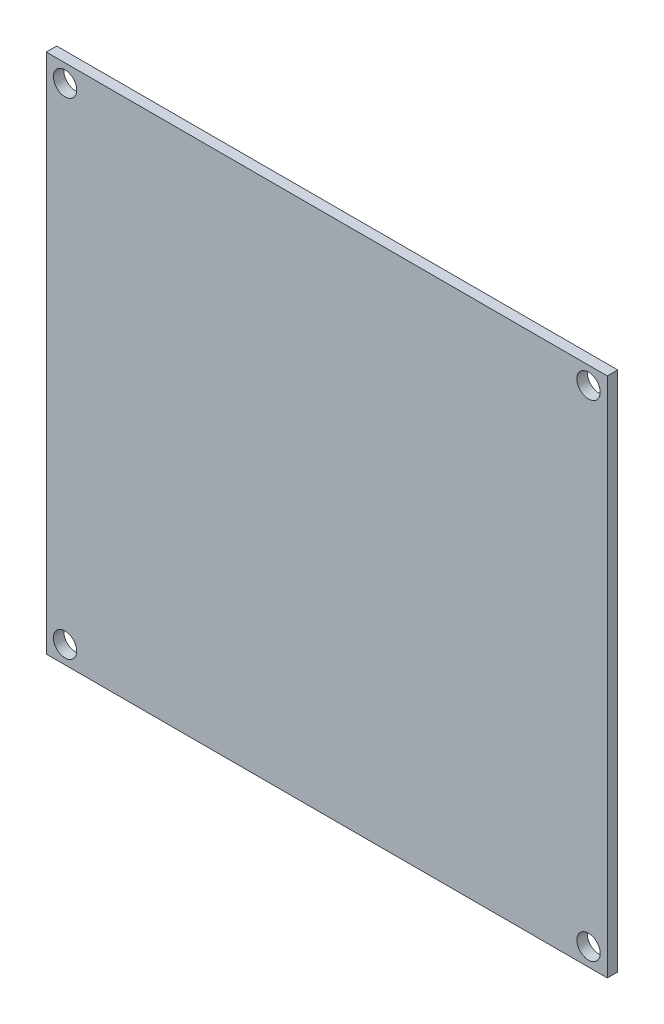
ISO-10303-21;
HEADER;
FILE_DESCRIPTION(('STEP AP214'),'2;1');
FILE_NAME('part.step','',(''),(''),'','','');
FILE_SCHEMA(('AUTOMOTIVE_DESIGN { 1 0 10303 214 1 1 1 1 }'));
ENDSEC;
DATA;
#1=APPLICATION_CONTEXT('core data for automotive mechanical design processes');
#2=APPLICATION_PROTOCOL_DEFINITION('international standard','automotive_design',2000,#1);
#3=PRODUCT_CONTEXT('',#1,'mechanical');
#4=PRODUCT('Part','Part','',(#3));
#5=PRODUCT_RELATED_PRODUCT_CATEGORY('part','',(#4));
#6=PRODUCT_DEFINITION_FORMATION('','',#4);
#7=PRODUCT_DEFINITION_CONTEXT('part definition',#1,'design');
#8=PRODUCT_DEFINITION('design','',#6,#7);
#9=PRODUCT_DEFINITION_SHAPE('','',#8);
#10=(LENGTH_UNIT() NAMED_UNIT(*) SI_UNIT(.MILLI.,.METRE.));
#11=(NAMED_UNIT(*) PLANE_ANGLE_UNIT() SI_UNIT($,.RADIAN.));
#12=(NAMED_UNIT(*) SI_UNIT($,.STERADIAN.) SOLID_ANGLE_UNIT());
#13=UNCERTAINTY_MEASURE_WITH_UNIT(LENGTH_MEASURE(1.E-05),#10,'distance_accuracy_value','');
#14=(GEOMETRIC_REPRESENTATION_CONTEXT(3) GLOBAL_UNCERTAINTY_ASSIGNED_CONTEXT((#13)) GLOBAL_UNIT_ASSIGNED_CONTEXT((#10,
#11,#12)) REPRESENTATION_CONTEXT('',''));
#15=CARTESIAN_POINT('',(0.,0.,0.));
#16=DIRECTION('',(0.,0.,1.));
#17=DIRECTION('',(1.,0.,0.));
#18=AXIS2_PLACEMENT_3D('',#15,#16,#17);
#19=CARTESIAN_POINT('',(68.326,-63.5,2.54));
#20=DIRECTION('',(-1.,0.,0.));
#21=DIRECTION('',(0.,0.,1.));
#22=AXIS2_PLACEMENT_3D('',#19,#20,#21);
#23=PLANE('',#22);
#24=DIRECTION('',(0.,1.,0.));
#25=VECTOR('',#24,1.);
#26=CARTESIAN_POINT('',(68.326,-63.5,0.));
#27=LINE('',#26,#25);
#28=CARTESIAN_POINT('',(68.326,-63.5,0.));
#29=VERTEX_POINT('',#28);
#30=CARTESIAN_POINT('',(68.326,63.5,0.));
#31=VERTEX_POINT('',#30);
#32=EDGE_CURVE('E110',#29,#31,#27,.T.);
#33=ORIENTED_EDGE('',*,*,#32,.T.);
#34=DIRECTION('',(0.,0.,-1.));
#35=VECTOR('',#34,1.);
#36=CARTESIAN_POINT('',(68.326,63.5,2.54));
#37=LINE('',#36,#35);
#38=CARTESIAN_POINT('',(68.326,63.5,2.54));
#39=VERTEX_POINT('',#38);
#40=EDGE_CURVE('E12',#39,#31,#37,.T.);
#41=ORIENTED_EDGE('',*,*,#40,.F.);
#42=DIRECTION('',(0.,1.,0.));
#43=VECTOR('',#42,1.);
#44=CARTESIAN_POINT('',(68.326,-63.5,2.54));
#45=LINE('',#44,#43);
#46=CARTESIAN_POINT('',(68.326,-63.5,2.54));
#47=VERTEX_POINT('',#46);
#48=EDGE_CURVE('E92',#47,#39,#45,.T.);
#49=ORIENTED_EDGE('',*,*,#48,.F.);
#50=DIRECTION('',(0.,0.,-1.));
#51=VECTOR('',#50,1.);
#52=CARTESIAN_POINT('',(68.326,-63.5,2.54));
#53=LINE('',#52,#51);
#54=EDGE_CURVE('E59',#47,#29,#53,.T.);
#55=ORIENTED_EDGE('',*,*,#54,.T.);
#56=EDGE_LOOP('',(#33,#41,#49,#55));
#57=FACE_BOUND('',#56,.T.);
#58=ADVANCED_FACE('F42',(#57),#23,.F.);
#59=CARTESIAN_POINT('',(68.326,63.5,2.54));
#60=DIRECTION('',(0.,-1.,0.));
#61=DIRECTION('',(1.,0.,0.));
#62=AXIS2_PLACEMENT_3D('',#59,#60,#61);
#63=PLANE('',#62);
#64=DIRECTION('',(-1.,0.,0.));
#65=VECTOR('',#64,1.);
#66=CARTESIAN_POINT('',(68.326,63.5,0.));
#67=LINE('',#66,#65);
#68=CARTESIAN_POINT('',(-68.326,63.5,0.));
#69=VERTEX_POINT('',#68);
#70=EDGE_CURVE('E98',#31,#69,#67,.T.);
#71=ORIENTED_EDGE('',*,*,#70,.T.);
#72=DIRECTION('',(0.,0.,-1.));
#73=VECTOR('',#72,1.);
#74=CARTESIAN_POINT('',(-68.326,63.5,2.54));
#75=LINE('',#74,#73);
#76=CARTESIAN_POINT('',(-68.326,63.5,2.54));
#77=VERTEX_POINT('',#76);
#78=EDGE_CURVE('E51',#77,#69,#75,.T.);
#79=ORIENTED_EDGE('',*,*,#78,.F.);
#80=DIRECTION('',(-1.,0.,0.));
#81=VECTOR('',#80,1.);
#82=CARTESIAN_POINT('',(68.326,63.5,2.54));
#83=LINE('',#82,#81);
#84=EDGE_CURVE('E84',#39,#77,#83,.T.);
#85=ORIENTED_EDGE('',*,*,#84,.F.);
#86=ORIENTED_EDGE('',*,*,#40,.T.);
#87=EDGE_LOOP('',(#71,#79,#85,#86));
#88=FACE_BOUND('',#87,.T.);
#89=ADVANCED_FACE('F97',(#88),#63,.F.);
#90=CARTESIAN_POINT('',(-68.326,-63.5,2.54));
#91=DIRECTION('',(-1.,0.,0.));
#92=DIRECTION('',(0.,0.,1.));
#93=AXIS2_PLACEMENT_3D('',#90,#91,#92);
#94=PLANE('',#93);
#95=DIRECTION('',(0.,1.,0.));
#96=VECTOR('',#95,1.);
#97=CARTESIAN_POINT('',(-68.326,-63.5,0.));
#98=LINE('',#97,#96);
#99=CARTESIAN_POINT('',(-68.326,-63.5,0.));
#100=VERTEX_POINT('',#99);
#101=EDGE_CURVE('E116',#100,#69,#98,.T.);
#102=ORIENTED_EDGE('',*,*,#101,.F.);
#103=DIRECTION('',(0.,0.,-1.));
#104=VECTOR('',#103,1.);
#105=CARTESIAN_POINT('',(-68.326,-63.5,2.54));
#106=LINE('',#105,#104);
#107=CARTESIAN_POINT('',(-68.326,-63.5,2.54));
#108=VERTEX_POINT('',#107);
#109=EDGE_CURVE('E73',#108,#100,#106,.T.);
#110=ORIENTED_EDGE('',*,*,#109,.F.);
#111=DIRECTION('',(0.,1.,0.));
#112=VECTOR('',#111,1.);
#113=CARTESIAN_POINT('',(-68.326,-63.5,2.54));
#114=LINE('',#113,#112);
#115=EDGE_CURVE('E91',#108,#77,#114,.T.);
#116=ORIENTED_EDGE('',*,*,#115,.T.);
#117=ORIENTED_EDGE('',*,*,#78,.T.);
#118=EDGE_LOOP('',(#102,#110,#116,#117));
#119=FACE_BOUND('',#118,.T.);
#120=ADVANCED_FACE('F102',(#119),#94,.T.);
#121=CARTESIAN_POINT('',(68.326,-63.5,2.54));
#122=DIRECTION('',(0.,-1.,0.));
#123=DIRECTION('',(1.,0.,0.));
#124=AXIS2_PLACEMENT_3D('',#121,#122,#123);
#125=PLANE('',#124);
#126=DIRECTION('',(-1.,0.,0.));
#127=VECTOR('',#126,1.);
#128=CARTESIAN_POINT('',(68.326,-63.5,0.));
#129=LINE('',#128,#127);
#130=EDGE_CURVE('E119',#29,#100,#129,.T.);
#131=ORIENTED_EDGE('',*,*,#130,.F.);
#132=ORIENTED_EDGE('',*,*,#54,.F.);
#133=DIRECTION('',(-1.,0.,0.));
#134=VECTOR('',#133,1.);
#135=CARTESIAN_POINT('',(68.326,-63.5,2.54));
#136=LINE('',#135,#134);
#137=EDGE_CURVE('E104',#47,#108,#136,.T.);
#138=ORIENTED_EDGE('',*,*,#137,.T.);
#139=ORIENTED_EDGE('',*,*,#109,.T.);
#140=EDGE_LOOP('',(#131,#132,#138,#139));
#141=FACE_BOUND('',#140,.T.);
#142=ADVANCED_FACE('F185',(#141),#125,.T.);
#143=CARTESIAN_POINT('',(0.,0.,2.54));
#144=DIRECTION('',(0.,0.,1.));
#145=DIRECTION('',(1.,0.,0.));
#146=AXIS2_PLACEMENT_3D('',#143,#144,#145);
#147=PLANE('',#146);
#148=CARTESIAN_POINT('',(63.754,59.182,2.54));
#149=DIRECTION('',(0.,0.,1.));
#150=DIRECTION('',(1.,0.,0.));
#151=AXIS2_PLACEMENT_3D('',#148,#149,#150);
#152=CIRCLE('',#151,2.8448);
#153=CARTESIAN_POINT('',(60.9092,59.182,2.54));
#154=VERTEX_POINT('',#153);
#155=EDGE_CURVE('E113',#154,#154,#152,.F.);
#156=ORIENTED_EDGE('',*,*,#155,.T.);
#157=EDGE_LOOP('',(#156));
#158=FACE_BOUND('',#157,.T.);
#159=CARTESIAN_POINT('',(63.754,-59.182,2.54));
#160=DIRECTION('',(0.,0.,1.));
#161=DIRECTION('',(1.,0.,0.));
#162=AXIS2_PLACEMENT_3D('',#159,#160,#161);
#163=CIRCLE('',#162,2.8448);
#164=CARTESIAN_POINT('',(60.9092,-59.182,2.54));
#165=VERTEX_POINT('',#164);
#166=EDGE_CURVE('E132',#165,#165,#163,.F.);
#167=ORIENTED_EDGE('',*,*,#166,.T.);
#168=EDGE_LOOP('',(#167));
#169=FACE_BOUND('',#168,.T.);
#170=CARTESIAN_POINT('',(-63.754,-59.182,2.54));
#171=DIRECTION('',(0.,0.,1.));
#172=DIRECTION('',(1.,0.,0.));
#173=AXIS2_PLACEMENT_3D('',#170,#171,#172);
#174=CIRCLE('',#173,2.8448);
#175=CARTESIAN_POINT('',(-66.5988,-59.182,2.54));
#176=VERTEX_POINT('',#175);
#177=EDGE_CURVE('E136',#176,#176,#174,.F.);
#178=ORIENTED_EDGE('',*,*,#177,.T.);
#179=EDGE_LOOP('',(#178));
#180=FACE_BOUND('',#179,.T.);
#181=CARTESIAN_POINT('',(-63.754,59.182,2.54));
#182=DIRECTION('',(0.,0.,1.));
#183=DIRECTION('',(1.,0.,0.));
#184=AXIS2_PLACEMENT_3D('',#181,#182,#183);
#185=CIRCLE('',#184,2.8448);
#186=CARTESIAN_POINT('',(-66.5988,59.182,2.54));
#187=VERTEX_POINT('',#186);
#188=EDGE_CURVE('E140',#187,#187,#185,.F.);
#189=ORIENTED_EDGE('',*,*,#188,.T.);
#190=EDGE_LOOP('',(#189));
#191=FACE_BOUND('',#190,.T.);
#192=ORIENTED_EDGE('',*,*,#48,.T.);
#193=ORIENTED_EDGE('',*,*,#84,.T.);
#194=ORIENTED_EDGE('',*,*,#115,.F.);
#195=ORIENTED_EDGE('',*,*,#137,.F.);
#196=EDGE_LOOP('',(#192,#193,#194,#195));
#197=FACE_BOUND('',#196,.T.);
#198=ADVANCED_FACE('F88',(#158,#169,#180,#191,#197),#147,.T.);
#199=CARTESIAN_POINT('',(0.,0.,0.));
#200=DIRECTION('',(0.,0.,1.));
#201=DIRECTION('',(1.,0.,0.));
#202=AXIS2_PLACEMENT_3D('',#199,#200,#201);
#203=PLANE('',#202);
#204=CARTESIAN_POINT('',(63.754,59.182,0.));
#205=DIRECTION('',(0.,0.,1.));
#206=DIRECTION('',(-1.,0.,0.));
#207=AXIS2_PLACEMENT_3D('',#204,#205,#206);
#208=CIRCLE('',#207,2.8448);
#209=CARTESIAN_POINT('',(60.9092,59.182,0.));
#210=VERTEX_POINT('',#209);
#211=EDGE_CURVE('E148',#210,#210,#208,.T.);
#212=ORIENTED_EDGE('',*,*,#211,.T.);
#213=EDGE_LOOP('',(#212));
#214=FACE_BOUND('',#213,.T.);
#215=CARTESIAN_POINT('',(63.754,-59.182,0.));
#216=DIRECTION('',(0.,0.,1.));
#217=DIRECTION('',(1.,0.,0.));
#218=AXIS2_PLACEMENT_3D('',#215,#216,#217);
#219=CIRCLE('',#218,2.8448);
#220=CARTESIAN_POINT('',(60.9092,-59.182,0.));
#221=VERTEX_POINT('',#220);
#222=EDGE_CURVE('E149',#221,#221,#219,.T.);
#223=ORIENTED_EDGE('',*,*,#222,.T.);
#224=EDGE_LOOP('',(#223));
#225=FACE_BOUND('',#224,.T.);
#226=CARTESIAN_POINT('',(-63.754,-59.182,0.));
#227=DIRECTION('',(0.,0.,1.));
#228=DIRECTION('',(-1.,0.,0.));
#229=AXIS2_PLACEMENT_3D('',#226,#227,#228);
#230=CIRCLE('',#229,2.8448);
#231=CARTESIAN_POINT('',(-66.5988,-59.182,0.));
#232=VERTEX_POINT('',#231);
#233=EDGE_CURVE('E153',#232,#232,#230,.T.);
#234=ORIENTED_EDGE('',*,*,#233,.T.);
#235=EDGE_LOOP('',(#234));
#236=FACE_BOUND('',#235,.T.);
#237=CARTESIAN_POINT('',(-63.754,59.182,0.));
#238=DIRECTION('',(0.,0.,1.));
#239=DIRECTION('',(1.,0.,0.));
#240=AXIS2_PLACEMENT_3D('',#237,#238,#239);
#241=CIRCLE('',#240,2.8448);
#242=CARTESIAN_POINT('',(-66.5988,59.182,0.));
#243=VERTEX_POINT('',#242);
#244=EDGE_CURVE('E144',#243,#243,#241,.T.);
#245=ORIENTED_EDGE('',*,*,#244,.T.);
#246=EDGE_LOOP('',(#245));
#247=FACE_BOUND('',#246,.T.);
#248=ORIENTED_EDGE('',*,*,#32,.F.);
#249=ORIENTED_EDGE('',*,*,#130,.T.);
#250=ORIENTED_EDGE('',*,*,#101,.T.);
#251=ORIENTED_EDGE('',*,*,#70,.F.);
#252=EDGE_LOOP('',(#248,#249,#250,#251));
#253=FACE_BOUND('',#252,.T.);
#254=ADVANCED_FACE('F161',(#214,#225,#236,#247,#253),#203,.F.);
#255=CARTESIAN_POINT('',(-63.754,59.182,30.48));
#256=DIRECTION('',(0.,0.,-1.));
#257=DIRECTION('',(-1.,0.,0.));
#258=AXIS2_PLACEMENT_3D('',#255,#256,#257);
#259=CYLINDRICAL_SURFACE('',#258,2.8448);
#260=CARTESIAN_POINT('',(-66.5988,59.182,2.54));
#261=CARTESIAN_POINT('',(-66.5988,59.182,2.51354166666667));
#262=CARTESIAN_POINT('',(-66.5988,59.182,2.48708333333333));
#263=CARTESIAN_POINT('',(-66.5988,59.182,2.43416666666667));
#264=CARTESIAN_POINT('',(-66.5988,59.182,2.40770833333333));
#265=CARTESIAN_POINT('',(-66.5988,59.182,2.35479166666667));
#266=CARTESIAN_POINT('',(-66.5988,59.182,2.32833333333333));
#267=CARTESIAN_POINT('',(-66.5988,59.182,2.27541666666667));
#268=CARTESIAN_POINT('',(-66.5988,59.182,2.24895833333334));
#269=CARTESIAN_POINT('',(-66.5988,59.182,2.19604166666667));
#270=CARTESIAN_POINT('',(-66.5988,59.182,2.16958333333333));
#271=CARTESIAN_POINT('',(-66.5988,59.182,2.11666666666667));
#272=CARTESIAN_POINT('',(-66.5988,59.182,2.09020833333333));
#273=CARTESIAN_POINT('',(-66.5988,59.182,2.03729166666667));
#274=CARTESIAN_POINT('',(-66.5988,59.182,2.01083333333333));
#275=CARTESIAN_POINT('',(-66.5988,59.182,1.95791666666667));
#276=CARTESIAN_POINT('',(-66.5988,59.182,1.93145833333333));
#277=CARTESIAN_POINT('',(-66.5988,59.182,1.87854166666667));
#278=CARTESIAN_POINT('',(-66.5988,59.182,1.85208333333333));
#279=CARTESIAN_POINT('',(-66.5988,59.182,1.79916666666667));
#280=CARTESIAN_POINT('',(-66.5988,59.182,1.77270833333333));
#281=CARTESIAN_POINT('',(-66.5988,59.182,1.71979166666667));
#282=CARTESIAN_POINT('',(-66.5988,59.182,1.69333333333333));
#283=CARTESIAN_POINT('',(-66.5988,59.182,1.64041666666667));
#284=CARTESIAN_POINT('',(-66.5988,59.182,1.61395833333333));
#285=CARTESIAN_POINT('',(-66.5988,59.182,1.56104166666667));
#286=CARTESIAN_POINT('',(-66.5988,59.182,1.53458333333333));
#287=CARTESIAN_POINT('',(-66.5988,59.182,1.48166666666667));
#288=CARTESIAN_POINT('',(-66.5988,59.182,1.45520833333333));
#289=CARTESIAN_POINT('',(-66.5988,59.182,1.40229166666667));
#290=CARTESIAN_POINT('',(-66.5988,59.182,1.37583333333333));
#291=CARTESIAN_POINT('',(-66.5988,59.182,1.32291666666667));
#292=CARTESIAN_POINT('',(-66.5988,59.182,1.29645833333333));
#293=CARTESIAN_POINT('',(-66.5988,59.182,1.24354166666667));
#294=CARTESIAN_POINT('',(-66.5988,59.182,1.21708333333333));
#295=CARTESIAN_POINT('',(-66.5988,59.182,1.16416666666667));
#296=CARTESIAN_POINT('',(-66.5988,59.182,1.13770833333333));
#297=CARTESIAN_POINT('',(-66.5988,59.182,1.08479166666667));
#298=CARTESIAN_POINT('',(-66.5988,59.182,1.05833333333333));
#299=CARTESIAN_POINT('',(-66.5988,59.182,1.00541666666667));
#300=CARTESIAN_POINT('',(-66.5988,59.182,0.978958333333335));
#301=CARTESIAN_POINT('',(-66.5988,59.182,0.926041666666668));
#302=CARTESIAN_POINT('',(-66.5988,59.182,0.899583333333333));
#303=CARTESIAN_POINT('',(-66.5988,59.182,0.846666666666666));
#304=CARTESIAN_POINT('',(-66.5988,59.182,0.820208333333333));
#305=CARTESIAN_POINT('',(-66.5988,59.182,0.767291666666666));
#306=CARTESIAN_POINT('',(-66.5988,59.182,0.740833333333333));
#307=CARTESIAN_POINT('',(-66.5988,59.182,0.687916666666667));
#308=CARTESIAN_POINT('',(-66.5988,59.182,0.661458333333333));
#309=CARTESIAN_POINT('',(-66.5988,59.182,0.608541666666667));
#310=CARTESIAN_POINT('',(-66.5988,59.182,0.582083333333334));
#311=CARTESIAN_POINT('',(-66.5988,59.182,0.529166666666667));
#312=CARTESIAN_POINT('',(-66.5988,59.182,0.502708333333334));
#313=CARTESIAN_POINT('',(-66.5988,59.182,0.449791666666668));
#314=CARTESIAN_POINT('',(-66.5988,59.182,0.423333333333335));
#315=CARTESIAN_POINT('',(-66.5988,59.182,0.370416666666667));
#316=CARTESIAN_POINT('',(-66.5988,59.182,0.343958333333333));
#317=CARTESIAN_POINT('',(-66.5988,59.182,0.291041666666665));
#318=CARTESIAN_POINT('',(-66.5988,59.182,0.264583333333332));
#319=CARTESIAN_POINT('',(-66.5988,59.182,0.211666666666666));
#320=CARTESIAN_POINT('',(-66.5988,59.182,0.185208333333332));
#321=CARTESIAN_POINT('',(-66.5988,59.182,0.132291666666666));
#322=CARTESIAN_POINT('',(-66.5988,59.182,0.105833333333333));
#323=CARTESIAN_POINT('',(-66.5988,59.182,0.0529166666666664));
#324=CARTESIAN_POINT('',(-66.5988,59.182,0.0264583333333332));
#325=CARTESIAN_POINT('',(-66.5988,59.182,0.));
#326=B_SPLINE_CURVE_WITH_KNOTS('',3,(#260,#261,#262,#263,#264,#265,#266,#267,#268,#269,#270,
#271,#272,#273,#274,#275,#276,#277,#278,#279,#280,#281,#282,#283,#284,#285,#286,#287,#288,#289,
#290,#291,#292,#293,#294,#295,#296,#297,#298,#299,#300,#301,#302,#303,#304,#305,#306,#307,#308,
#309,#310,#311,#312,#313,#314,#315,#316,#317,#318,#319,#320,#321,#322,#323,#324,#325),
.UNSPECIFIED.,.F.,.F.,(4,2,2,2,2,2,2,2,2,2,2,2,2,2,2,2,2,2,2,2,2,2,2,2,2,2,2,2,2,2,2,2,4),(0.,
0.0793749999999996,0.158749999999999,0.238124999999999,0.317499999999998,0.396875000000001,
0.476250000000001,0.555625000000001,0.635,0.714375,0.793749999999999,0.873124999999999,
0.952500000000002,1.031875,1.11125,1.190625,1.27,1.349375,1.42875,1.508125,1.5875,1.666875,
1.74625,1.825625,1.905,1.984375,2.06375,2.143125,2.2225,2.301875,2.38125,2.460625,2.54),.UNSPECIFIED.);
#327=EDGE_CURVE('BSEAM167',#187,#243,#326,.T.);
#328=ORIENTED_EDGE('',*,*,#188,.F.);
#329=ORIENTED_EDGE('',*,*,#244,.F.);
#330=ORIENTED_EDGE('',*,*,#327,.T.);
#331=ORIENTED_EDGE('',*,*,#327,.F.);
#332=EDGE_LOOP('',(#328,#330,#329,#331));
#333=FACE_BOUND('',#332,.T.);
#334=ADVANCED_FACE('F167',(#333),#259,.F.);
#335=CARTESIAN_POINT('',(-63.754,-59.182,30.48));
#336=DIRECTION('',(0.,0.,-1.));
#337=DIRECTION('',(-1.,0.,0.));
#338=AXIS2_PLACEMENT_3D('',#335,#336,#337);
#339=CYLINDRICAL_SURFACE('',#338,2.8448);
#340=CARTESIAN_POINT('',(-66.5988,-59.182,2.54));
#341=CARTESIAN_POINT('',(-66.5988,-59.182,2.51354166666667));
#342=CARTESIAN_POINT('',(-66.5988,-59.182,2.48708333333333));
#343=CARTESIAN_POINT('',(-66.5988,-59.182,2.43416666666667));
#344=CARTESIAN_POINT('',(-66.5988,-59.182,2.40770833333333));
#345=CARTESIAN_POINT('',(-66.5988,-59.182,2.35479166666667));
#346=CARTESIAN_POINT('',(-66.5988,-59.182,2.32833333333333));
#347=CARTESIAN_POINT('',(-66.5988,-59.182,2.27541666666667));
#348=CARTESIAN_POINT('',(-66.5988,-59.182,2.24895833333334));
#349=CARTESIAN_POINT('',(-66.5988,-59.182,2.19604166666667));
#350=CARTESIAN_POINT('',(-66.5988,-59.182,2.16958333333333));
#351=CARTESIAN_POINT('',(-66.5988,-59.182,2.11666666666667));
#352=CARTESIAN_POINT('',(-66.5988,-59.182,2.09020833333333));
#353=CARTESIAN_POINT('',(-66.5988,-59.182,2.03729166666667));
#354=CARTESIAN_POINT('',(-66.5988,-59.182,2.01083333333333));
#355=CARTESIAN_POINT('',(-66.5988,-59.182,1.95791666666667));
#356=CARTESIAN_POINT('',(-66.5988,-59.182,1.93145833333333));
#357=CARTESIAN_POINT('',(-66.5988,-59.182,1.87854166666667));
#358=CARTESIAN_POINT('',(-66.5988,-59.182,1.85208333333333));
#359=CARTESIAN_POINT('',(-66.5988,-59.182,1.79916666666667));
#360=CARTESIAN_POINT('',(-66.5988,-59.182,1.77270833333333));
#361=CARTESIAN_POINT('',(-66.5988,-59.182,1.71979166666667));
#362=CARTESIAN_POINT('',(-66.5988,-59.182,1.69333333333333));
#363=CARTESIAN_POINT('',(-66.5988,-59.182,1.64041666666667));
#364=CARTESIAN_POINT('',(-66.5988,-59.182,1.61395833333333));
#365=CARTESIAN_POINT('',(-66.5988,-59.182,1.56104166666667));
#366=CARTESIAN_POINT('',(-66.5988,-59.182,1.53458333333333));
#367=CARTESIAN_POINT('',(-66.5988,-59.182,1.48166666666667));
#368=CARTESIAN_POINT('',(-66.5988,-59.182,1.45520833333333));
#369=CARTESIAN_POINT('',(-66.5988,-59.182,1.40229166666667));
#370=CARTESIAN_POINT('',(-66.5988,-59.182,1.37583333333333));
#371=CARTESIAN_POINT('',(-66.5988,-59.182,1.32291666666667));
#372=CARTESIAN_POINT('',(-66.5988,-59.182,1.29645833333333));
#373=CARTESIAN_POINT('',(-66.5988,-59.182,1.24354166666667));
#374=CARTESIAN_POINT('',(-66.5988,-59.182,1.21708333333333));
#375=CARTESIAN_POINT('',(-66.5988,-59.182,1.16416666666667));
#376=CARTESIAN_POINT('',(-66.5988,-59.182,1.13770833333333));
#377=CARTESIAN_POINT('',(-66.5988,-59.182,1.08479166666667));
#378=CARTESIAN_POINT('',(-66.5988,-59.182,1.05833333333333));
#379=CARTESIAN_POINT('',(-66.5988,-59.182,1.00541666666667));
#380=CARTESIAN_POINT('',(-66.5988,-59.182,0.978958333333335));
#381=CARTESIAN_POINT('',(-66.5988,-59.182,0.926041666666668));
#382=CARTESIAN_POINT('',(-66.5988,-59.182,0.899583333333333));
#383=CARTESIAN_POINT('',(-66.5988,-59.182,0.846666666666666));
#384=CARTESIAN_POINT('',(-66.5988,-59.182,0.820208333333333));
#385=CARTESIAN_POINT('',(-66.5988,-59.182,0.767291666666666));
#386=CARTESIAN_POINT('',(-66.5988,-59.182,0.740833333333333));
#387=CARTESIAN_POINT('',(-66.5988,-59.182,0.687916666666667));
#388=CARTESIAN_POINT('',(-66.5988,-59.182,0.661458333333333));
#389=CARTESIAN_POINT('',(-66.5988,-59.182,0.608541666666667));
#390=CARTESIAN_POINT('',(-66.5988,-59.182,0.582083333333334));
#391=CARTESIAN_POINT('',(-66.5988,-59.182,0.529166666666667));
#392=CARTESIAN_POINT('',(-66.5988,-59.182,0.502708333333334));
#393=CARTESIAN_POINT('',(-66.5988,-59.182,0.449791666666668));
#394=CARTESIAN_POINT('',(-66.5988,-59.182,0.423333333333335));
#395=CARTESIAN_POINT('',(-66.5988,-59.182,0.370416666666667));
#396=CARTESIAN_POINT('',(-66.5988,-59.182,0.343958333333333));
#397=CARTESIAN_POINT('',(-66.5988,-59.182,0.291041666666665));
#398=CARTESIAN_POINT('',(-66.5988,-59.182,0.264583333333332));
#399=CARTESIAN_POINT('',(-66.5988,-59.182,0.211666666666666));
#400=CARTESIAN_POINT('',(-66.5988,-59.182,0.185208333333332));
#401=CARTESIAN_POINT('',(-66.5988,-59.182,0.132291666666666));
#402=CARTESIAN_POINT('',(-66.5988,-59.182,0.105833333333333));
#403=CARTESIAN_POINT('',(-66.5988,-59.182,0.0529166666666664));
#404=CARTESIAN_POINT('',(-66.5988,-59.182,0.0264583333333332));
#405=CARTESIAN_POINT('',(-66.5988,-59.182,0.));
#406=B_SPLINE_CURVE_WITH_KNOTS('',3,(#340,#341,#342,#343,#344,#345,#346,#347,#348,#349,#350,
#351,#352,#353,#354,#355,#356,#357,#358,#359,#360,#361,#362,#363,#364,#365,#366,#367,#368,#369,
#370,#371,#372,#373,#374,#375,#376,#377,#378,#379,#380,#381,#382,#383,#384,#385,#386,#387,#388,
#389,#390,#391,#392,#393,#394,#395,#396,#397,#398,#399,#400,#401,#402,#403,#404,#405),
.UNSPECIFIED.,.F.,.F.,(4,2,2,2,2,2,2,2,2,2,2,2,2,2,2,2,2,2,2,2,2,2,2,2,2,2,2,2,2,2,2,2,4),(0.,
0.0793749999999996,0.158749999999999,0.238124999999999,0.317499999999998,0.396875000000001,
0.476250000000001,0.555625000000001,0.635,0.714375,0.793749999999999,0.873124999999999,
0.952500000000002,1.031875,1.11125,1.190625,1.27,1.349375,1.42875,1.508125,1.5875,1.666875,
1.74625,1.825625,1.905,1.984375,2.06375,2.143125,2.2225,2.301875,2.38125,2.460625,2.54),.UNSPECIFIED.);
#407=EDGE_CURVE('BSEAM164',#176,#232,#406,.T.);
#408=ORIENTED_EDGE('',*,*,#177,.F.);
#409=ORIENTED_EDGE('',*,*,#233,.F.);
#410=ORIENTED_EDGE('',*,*,#407,.T.);
#411=ORIENTED_EDGE('',*,*,#407,.F.);
#412=EDGE_LOOP('',(#408,#410,#409,#411));
#413=FACE_BOUND('',#412,.T.);
#414=ADVANCED_FACE('F164',(#413),#339,.F.);
#415=CARTESIAN_POINT('',(63.754,-59.182,30.48));
#416=DIRECTION('',(0.,0.,-1.));
#417=DIRECTION('',(-1.,0.,0.));
#418=AXIS2_PLACEMENT_3D('',#415,#416,#417);
#419=CYLINDRICAL_SURFACE('',#418,2.8448);
#420=CARTESIAN_POINT('',(60.9092,-59.182,2.54));
#421=CARTESIAN_POINT('',(60.9092,-59.182,2.51354166666667));
#422=CARTESIAN_POINT('',(60.9092,-59.182,2.48708333333333));
#423=CARTESIAN_POINT('',(60.9092,-59.182,2.43416666666667));
#424=CARTESIAN_POINT('',(60.9092,-59.182,2.40770833333333));
#425=CARTESIAN_POINT('',(60.9092,-59.182,2.35479166666667));
#426=CARTESIAN_POINT('',(60.9092,-59.182,2.32833333333333));
#427=CARTESIAN_POINT('',(60.9092,-59.182,2.27541666666667));
#428=CARTESIAN_POINT('',(60.9092,-59.182,2.24895833333334));
#429=CARTESIAN_POINT('',(60.9092,-59.182,2.19604166666667));
#430=CARTESIAN_POINT('',(60.9092,-59.182,2.16958333333333));
#431=CARTESIAN_POINT('',(60.9092,-59.182,2.11666666666667));
#432=CARTESIAN_POINT('',(60.9092,-59.182,2.09020833333333));
#433=CARTESIAN_POINT('',(60.9092,-59.182,2.03729166666667));
#434=CARTESIAN_POINT('',(60.9092,-59.182,2.01083333333333));
#435=CARTESIAN_POINT('',(60.9092,-59.182,1.95791666666667));
#436=CARTESIAN_POINT('',(60.9092,-59.182,1.93145833333333));
#437=CARTESIAN_POINT('',(60.9092,-59.182,1.87854166666667));
#438=CARTESIAN_POINT('',(60.9092,-59.182,1.85208333333333));
#439=CARTESIAN_POINT('',(60.9092,-59.182,1.79916666666667));
#440=CARTESIAN_POINT('',(60.9092,-59.182,1.77270833333333));
#441=CARTESIAN_POINT('',(60.9092,-59.182,1.71979166666667));
#442=CARTESIAN_POINT('',(60.9092,-59.182,1.69333333333333));
#443=CARTESIAN_POINT('',(60.9092,-59.182,1.64041666666667));
#444=CARTESIAN_POINT('',(60.9092,-59.182,1.61395833333333));
#445=CARTESIAN_POINT('',(60.9092,-59.182,1.56104166666667));
#446=CARTESIAN_POINT('',(60.9092,-59.182,1.53458333333333));
#447=CARTESIAN_POINT('',(60.9092,-59.182,1.48166666666667));
#448=CARTESIAN_POINT('',(60.9092,-59.182,1.45520833333333));
#449=CARTESIAN_POINT('',(60.9092,-59.182,1.40229166666667));
#450=CARTESIAN_POINT('',(60.9092,-59.182,1.37583333333333));
#451=CARTESIAN_POINT('',(60.9092,-59.182,1.32291666666667));
#452=CARTESIAN_POINT('',(60.9092,-59.182,1.29645833333333));
#453=CARTESIAN_POINT('',(60.9092,-59.182,1.24354166666667));
#454=CARTESIAN_POINT('',(60.9092,-59.182,1.21708333333333));
#455=CARTESIAN_POINT('',(60.9092,-59.182,1.16416666666667));
#456=CARTESIAN_POINT('',(60.9092,-59.182,1.13770833333333));
#457=CARTESIAN_POINT('',(60.9092,-59.182,1.08479166666667));
#458=CARTESIAN_POINT('',(60.9092,-59.182,1.05833333333333));
#459=CARTESIAN_POINT('',(60.9092,-59.182,1.00541666666667));
#460=CARTESIAN_POINT('',(60.9092,-59.182,0.978958333333335));
#461=CARTESIAN_POINT('',(60.9092,-59.182,0.926041666666668));
#462=CARTESIAN_POINT('',(60.9092,-59.182,0.899583333333333));
#463=CARTESIAN_POINT('',(60.9092,-59.182,0.846666666666666));
#464=CARTESIAN_POINT('',(60.9092,-59.182,0.820208333333333));
#465=CARTESIAN_POINT('',(60.9092,-59.182,0.767291666666666));
#466=CARTESIAN_POINT('',(60.9092,-59.182,0.740833333333333));
#467=CARTESIAN_POINT('',(60.9092,-59.182,0.687916666666667));
#468=CARTESIAN_POINT('',(60.9092,-59.182,0.661458333333333));
#469=CARTESIAN_POINT('',(60.9092,-59.182,0.608541666666667));
#470=CARTESIAN_POINT('',(60.9092,-59.182,0.582083333333334));
#471=CARTESIAN_POINT('',(60.9092,-59.182,0.529166666666667));
#472=CARTESIAN_POINT('',(60.9092,-59.182,0.502708333333334));
#473=CARTESIAN_POINT('',(60.9092,-59.182,0.449791666666668));
#474=CARTESIAN_POINT('',(60.9092,-59.182,0.423333333333335));
#475=CARTESIAN_POINT('',(60.9092,-59.182,0.370416666666667));
#476=CARTESIAN_POINT('',(60.9092,-59.182,0.343958333333333));
#477=CARTESIAN_POINT('',(60.9092,-59.182,0.291041666666665));
#478=CARTESIAN_POINT('',(60.9092,-59.182,0.264583333333332));
#479=CARTESIAN_POINT('',(60.9092,-59.182,0.211666666666666));
#480=CARTESIAN_POINT('',(60.9092,-59.182,0.185208333333332));
#481=CARTESIAN_POINT('',(60.9092,-59.182,0.132291666666666));
#482=CARTESIAN_POINT('',(60.9092,-59.182,0.105833333333333));
#483=CARTESIAN_POINT('',(60.9092,-59.182,0.0529166666666664));
#484=CARTESIAN_POINT('',(60.9092,-59.182,0.0264583333333332));
#485=CARTESIAN_POINT('',(60.9092,-59.182,0.));
#486=B_SPLINE_CURVE_WITH_KNOTS('',3,(#420,#421,#422,#423,#424,#425,#426,#427,#428,#429,#430,
#431,#432,#433,#434,#435,#436,#437,#438,#439,#440,#441,#442,#443,#444,#445,#446,#447,#448,#449,
#450,#451,#452,#453,#454,#455,#456,#457,#458,#459,#460,#461,#462,#463,#464,#465,#466,#467,#468,
#469,#470,#471,#472,#473,#474,#475,#476,#477,#478,#479,#480,#481,#482,#483,#484,#485),
.UNSPECIFIED.,.F.,.F.,(4,2,2,2,2,2,2,2,2,2,2,2,2,2,2,2,2,2,2,2,2,2,2,2,2,2,2,2,2,2,2,2,4),(0.,
0.0793749999999996,0.158749999999999,0.238124999999999,0.317499999999998,0.396875000000001,
0.476250000000001,0.555625000000001,0.635,0.714375,0.793749999999999,0.873124999999999,
0.952500000000002,1.031875,1.11125,1.190625,1.27,1.349375,1.42875,1.508125,1.5875,1.666875,
1.74625,1.825625,1.905,1.984375,2.06375,2.143125,2.2225,2.301875,2.38125,2.460625,2.54),.UNSPECIFIED.);
#487=EDGE_CURVE('BSEAM166',#165,#221,#486,.T.);
#488=ORIENTED_EDGE('',*,*,#166,.F.);
#489=ORIENTED_EDGE('',*,*,#222,.F.);
#490=ORIENTED_EDGE('',*,*,#487,.T.);
#491=ORIENTED_EDGE('',*,*,#487,.F.);
#492=EDGE_LOOP('',(#488,#490,#489,#491));
#493=FACE_BOUND('',#492,.T.);
#494=ADVANCED_FACE('F166',(#493),#419,.F.);
#495=CARTESIAN_POINT('',(63.754,59.182,30.48));
#496=DIRECTION('',(0.,0.,-1.));
#497=DIRECTION('',(-1.,0.,0.));
#498=AXIS2_PLACEMENT_3D('',#495,#496,#497);
#499=CYLINDRICAL_SURFACE('',#498,2.8448);
#500=CARTESIAN_POINT('',(60.9092,59.182,2.54));
#501=CARTESIAN_POINT('',(60.9092,59.182,2.51354166666667));
#502=CARTESIAN_POINT('',(60.9092,59.182,2.48708333333333));
#503=CARTESIAN_POINT('',(60.9092,59.182,2.43416666666667));
#504=CARTESIAN_POINT('',(60.9092,59.182,2.40770833333333));
#505=CARTESIAN_POINT('',(60.9092,59.182,2.35479166666667));
#506=CARTESIAN_POINT('',(60.9092,59.182,2.32833333333333));
#507=CARTESIAN_POINT('',(60.9092,59.182,2.27541666666667));
#508=CARTESIAN_POINT('',(60.9092,59.182,2.24895833333334));
#509=CARTESIAN_POINT('',(60.9092,59.182,2.19604166666667));
#510=CARTESIAN_POINT('',(60.9092,59.182,2.16958333333333));
#511=CARTESIAN_POINT('',(60.9092,59.182,2.11666666666667));
#512=CARTESIAN_POINT('',(60.9092,59.182,2.09020833333333));
#513=CARTESIAN_POINT('',(60.9092,59.182,2.03729166666667));
#514=CARTESIAN_POINT('',(60.9092,59.182,2.01083333333333));
#515=CARTESIAN_POINT('',(60.9092,59.182,1.95791666666667));
#516=CARTESIAN_POINT('',(60.9092,59.182,1.93145833333333));
#517=CARTESIAN_POINT('',(60.9092,59.182,1.87854166666667));
#518=CARTESIAN_POINT('',(60.9092,59.182,1.85208333333333));
#519=CARTESIAN_POINT('',(60.9092,59.182,1.79916666666667));
#520=CARTESIAN_POINT('',(60.9092,59.182,1.77270833333333));
#521=CARTESIAN_POINT('',(60.9092,59.182,1.71979166666667));
#522=CARTESIAN_POINT('',(60.9092,59.182,1.69333333333333));
#523=CARTESIAN_POINT('',(60.9092,59.182,1.64041666666667));
#524=CARTESIAN_POINT('',(60.9092,59.182,1.61395833333333));
#525=CARTESIAN_POINT('',(60.9092,59.182,1.56104166666667));
#526=CARTESIAN_POINT('',(60.9092,59.182,1.53458333333333));
#527=CARTESIAN_POINT('',(60.9092,59.182,1.48166666666667));
#528=CARTESIAN_POINT('',(60.9092,59.182,1.45520833333333));
#529=CARTESIAN_POINT('',(60.9092,59.182,1.40229166666667));
#530=CARTESIAN_POINT('',(60.9092,59.182,1.37583333333333));
#531=CARTESIAN_POINT('',(60.9092,59.182,1.32291666666667));
#532=CARTESIAN_POINT('',(60.9092,59.182,1.29645833333333));
#533=CARTESIAN_POINT('',(60.9092,59.182,1.24354166666667));
#534=CARTESIAN_POINT('',(60.9092,59.182,1.21708333333333));
#535=CARTESIAN_POINT('',(60.9092,59.182,1.16416666666667));
#536=CARTESIAN_POINT('',(60.9092,59.182,1.13770833333333));
#537=CARTESIAN_POINT('',(60.9092,59.182,1.08479166666667));
#538=CARTESIAN_POINT('',(60.9092,59.182,1.05833333333333));
#539=CARTESIAN_POINT('',(60.9092,59.182,1.00541666666667));
#540=CARTESIAN_POINT('',(60.9092,59.182,0.978958333333335));
#541=CARTESIAN_POINT('',(60.9092,59.182,0.926041666666668));
#542=CARTESIAN_POINT('',(60.9092,59.182,0.899583333333333));
#543=CARTESIAN_POINT('',(60.9092,59.182,0.846666666666666));
#544=CARTESIAN_POINT('',(60.9092,59.182,0.820208333333333));
#545=CARTESIAN_POINT('',(60.9092,59.182,0.767291666666666));
#546=CARTESIAN_POINT('',(60.9092,59.182,0.740833333333333));
#547=CARTESIAN_POINT('',(60.9092,59.182,0.687916666666667));
#548=CARTESIAN_POINT('',(60.9092,59.182,0.661458333333333));
#549=CARTESIAN_POINT('',(60.9092,59.182,0.608541666666667));
#550=CARTESIAN_POINT('',(60.9092,59.182,0.582083333333334));
#551=CARTESIAN_POINT('',(60.9092,59.182,0.529166666666667));
#552=CARTESIAN_POINT('',(60.9092,59.182,0.502708333333334));
#553=CARTESIAN_POINT('',(60.9092,59.182,0.449791666666668));
#554=CARTESIAN_POINT('',(60.9092,59.182,0.423333333333335));
#555=CARTESIAN_POINT('',(60.9092,59.182,0.370416666666667));
#556=CARTESIAN_POINT('',(60.9092,59.182,0.343958333333333));
#557=CARTESIAN_POINT('',(60.9092,59.182,0.291041666666665));
#558=CARTESIAN_POINT('',(60.9092,59.182,0.264583333333332));
#559=CARTESIAN_POINT('',(60.9092,59.182,0.211666666666666));
#560=CARTESIAN_POINT('',(60.9092,59.182,0.185208333333332));
#561=CARTESIAN_POINT('',(60.9092,59.182,0.132291666666666));
#562=CARTESIAN_POINT('',(60.9092,59.182,0.105833333333333));
#563=CARTESIAN_POINT('',(60.9092,59.182,0.0529166666666664));
#564=CARTESIAN_POINT('',(60.9092,59.182,0.0264583333333332));
#565=CARTESIAN_POINT('',(60.9092,59.182,0.));
#566=B_SPLINE_CURVE_WITH_KNOTS('',3,(#500,#501,#502,#503,#504,#505,#506,#507,#508,#509,#510,
#511,#512,#513,#514,#515,#516,#517,#518,#519,#520,#521,#522,#523,#524,#525,#526,#527,#528,#529,
#530,#531,#532,#533,#534,#535,#536,#537,#538,#539,#540,#541,#542,#543,#544,#545,#546,#547,#548,
#549,#550,#551,#552,#553,#554,#555,#556,#557,#558,#559,#560,#561,#562,#563,#564,#565),
.UNSPECIFIED.,.F.,.F.,(4,2,2,2,2,2,2,2,2,2,2,2,2,2,2,2,2,2,2,2,2,2,2,2,2,2,2,2,2,2,2,2,4),(0.,
0.0793749999999996,0.158749999999999,0.238124999999999,0.317499999999998,0.396875000000001,
0.476250000000001,0.555625000000001,0.635,0.714375,0.793749999999999,0.873124999999999,
0.952500000000002,1.031875,1.11125,1.190625,1.27,1.349375,1.42875,1.508125,1.5875,1.666875,
1.74625,1.825625,1.905,1.984375,2.06375,2.143125,2.2225,2.301875,2.38125,2.460625,2.54),.UNSPECIFIED.);
#567=EDGE_CURVE('BSEAM174',#154,#210,#566,.T.);
#568=ORIENTED_EDGE('',*,*,#155,.F.);
#569=ORIENTED_EDGE('',*,*,#211,.F.);
#570=ORIENTED_EDGE('',*,*,#567,.T.);
#571=ORIENTED_EDGE('',*,*,#567,.F.);
#572=EDGE_LOOP('',(#568,#570,#569,#571));
#573=FACE_BOUND('',#572,.T.);
#574=ADVANCED_FACE('F174',(#573),#499,.F.);
#575=CLOSED_SHELL('',(#58,#89,#120,#142,#198,#254,#334,#414,#494,#574));
#576=MANIFOLD_SOLID_BREP('B2',#575);
#577=ADVANCED_BREP_SHAPE_REPRESENTATION('',(#18,#576),#14);
#578=SHAPE_DEFINITION_REPRESENTATION(#9,#577);
ENDSEC;
END-ISO-10303-21;
